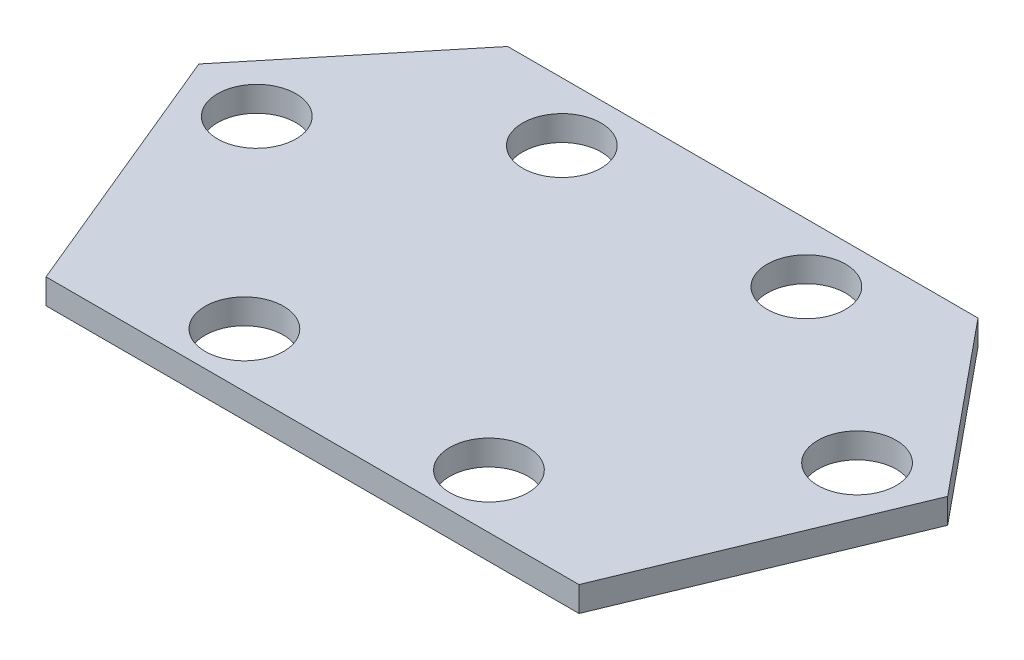
ISO-10303-21;
HEADER;
FILE_DESCRIPTION(('STEP AP214'),'2;1');
FILE_NAME('part.step','',(''),(''),'','','');
FILE_SCHEMA(('AUTOMOTIVE_DESIGN { 1 0 10303 214 1 1 1 1 }'));
ENDSEC;
DATA;
#1=APPLICATION_CONTEXT('core data for automotive mechanical design processes');
#2=APPLICATION_PROTOCOL_DEFINITION('international standard','automotive_design',2000,#1);
#3=PRODUCT_CONTEXT('',#1,'mechanical');
#4=PRODUCT('Part','Part','',(#3));
#5=PRODUCT_RELATED_PRODUCT_CATEGORY('part','',(#4));
#6=PRODUCT_DEFINITION_FORMATION('','',#4);
#7=PRODUCT_DEFINITION_CONTEXT('part definition',#1,'design');
#8=PRODUCT_DEFINITION('design','',#6,#7);
#9=PRODUCT_DEFINITION_SHAPE('','',#8);
#10=(LENGTH_UNIT() NAMED_UNIT(*) SI_UNIT(.MILLI.,.METRE.));
#11=(NAMED_UNIT(*) PLANE_ANGLE_UNIT() SI_UNIT($,.RADIAN.));
#12=(NAMED_UNIT(*) SI_UNIT($,.STERADIAN.) SOLID_ANGLE_UNIT());
#13=UNCERTAINTY_MEASURE_WITH_UNIT(LENGTH_MEASURE(1.E-05),#10,'distance_accuracy_value','');
#14=(GEOMETRIC_REPRESENTATION_CONTEXT(3) GLOBAL_UNCERTAINTY_ASSIGNED_CONTEXT((#13)) GLOBAL_UNIT_ASSIGNED_CONTEXT((#10,
#11,#12)) REPRESENTATION_CONTEXT('',''));
#15=CARTESIAN_POINT('',(0.,0.,0.));
#16=DIRECTION('',(0.,0.,1.));
#17=DIRECTION('',(1.,0.,0.));
#18=AXIS2_PLACEMENT_3D('',#15,#16,#17);
#19=CARTESIAN_POINT('',(0.,4.,0.));
#20=DIRECTION('',(0.,-1.,0.));
#21=DIRECTION('',(0.,0.,-1.));
#22=AXIS2_PLACEMENT_3D('',#19,#20,#21);
#23=PLANE('',#22);
#24=DIRECTION('',(-0.63458212057777,0.,-0.772855440715157));
#25=VECTOR('',#24,1.);
#26=CARTESIAN_POINT('',(75.,4.,-99.7096837484337));
#27=LINE('',#26,#25);
#28=CARTESIAN_POINT('',(119.420748440444,4.,-45.6098028983727));
#29=VERTEX_POINT('',#28);
#30=CARTESIAN_POINT('',(75.,4.,-99.7096837484337));
#31=VERTEX_POINT('',#30);
#32=EDGE_CURVE('E136',#29,#31,#27,.T.);
#33=ORIENTED_EDGE('',*,*,#32,.T.);
#34=DIRECTION('',(-1.,0.,0.));
#35=VECTOR('',#34,1.);
#36=CARTESIAN_POINT('',(-75.,4.,-99.7096837484337));
#37=LINE('',#36,#35);
#38=CARTESIAN_POINT('',(-75.,4.,-99.7096837484337));
#39=VERTEX_POINT('',#38);
#40=EDGE_CURVE('E94',#31,#39,#37,.T.);
#41=ORIENTED_EDGE('',*,*,#40,.T.);
#42=DIRECTION('',(-0.63458212057777,0.,0.772855440715157));
#43=VECTOR('',#42,1.);
#44=CARTESIAN_POINT('',(-75.,4.,-99.7096837484337));
#45=LINE('',#44,#43);
#46=CARTESIAN_POINT('',(-119.420748440444,4.,-45.6098028983727));
#47=VERTEX_POINT('',#46);
#48=EDGE_CURVE('E107',#39,#47,#45,.T.);
#49=ORIENTED_EDGE('',*,*,#48,.T.);
#50=DIRECTION('',(0.382452760449377,0.,0.923975046213182));
#51=VECTOR('',#50,1.);
#52=CARTESIAN_POINT('',(-119.420748440444,4.,-45.6098028983727));
#53=LINE('',#52,#51);
#54=CARTESIAN_POINT('',(-85.,4.,37.5479512608137));
#55=VERTEX_POINT('',#54);
#56=EDGE_CURVE('E101',#47,#55,#53,.T.);
#57=ORIENTED_EDGE('',*,*,#56,.T.);
#58=DIRECTION('',(1.,0.,0.));
#59=VECTOR('',#58,1.);
#60=CARTESIAN_POINT('',(85.,4.,37.5479512608137));
#61=LINE('',#60,#59);
#62=CARTESIAN_POINT('',(85.,4.,37.5479512608137));
#63=VERTEX_POINT('',#62);
#64=EDGE_CURVE('E105',#55,#63,#61,.T.);
#65=ORIENTED_EDGE('',*,*,#64,.T.);
#66=DIRECTION('',(0.382452760449377,0.,-0.923975046213182));
#67=VECTOR('',#66,1.);
#68=CARTESIAN_POINT('',(119.420748440444,4.,-45.6098028983727));
#69=LINE('',#68,#67);
#70=EDGE_CURVE('E57',#63,#29,#69,.T.);
#71=ORIENTED_EDGE('',*,*,#70,.T.);
#72=EDGE_LOOP('',(#33,#41,#49,#57,#65,#71));
#73=FACE_BOUND('',#72,.T.);
#74=CARTESIAN_POINT('',(-95.7300057121245,4.,-40.398538956961));
#75=DIRECTION('',(0.,1.,0.));
#76=DIRECTION('',(0.,0.,1.));
#77=AXIS2_PLACEMENT_3D('',#74,#75,#76);
#78=CIRCLE('',#77,12.5);
#79=CARTESIAN_POINT('',(-95.7300057121245,4.,-27.898538956961));
#80=VERTEX_POINT('',#79);
#81=EDGE_CURVE('E129',#80,#80,#78,.T.);
#82=ORIENTED_EDGE('',*,*,#81,.F.);
#83=EDGE_LOOP('',(#82));
#84=FACE_BOUND('',#83,.T.);
#85=CARTESIAN_POINT('',(-39.,4.,-80.9719510722377));
#86=DIRECTION('',(0.,1.,0.));
#87=DIRECTION('',(0.,0.,1.));
#88=AXIS2_PLACEMENT_3D('',#85,#86,#87);
#89=CIRCLE('',#88,12.5);
#90=CARTESIAN_POINT('',(-39.,4.,-68.4719510722377));
#91=VERTEX_POINT('',#90);
#92=EDGE_CURVE('E220',#91,#91,#89,.T.);
#93=ORIENTED_EDGE('',*,*,#92,.F.);
#94=EDGE_LOOP('',(#93));
#95=FACE_BOUND('',#94,.T.);
#96=CARTESIAN_POINT('',(-39.,4.,20.275462646618));
#97=DIRECTION('',(0.,1.,0.));
#98=DIRECTION('',(0.,0.,1.));
#99=AXIS2_PLACEMENT_3D('',#96,#97,#98);
#100=CIRCLE('',#99,12.5);
#101=CARTESIAN_POINT('',(-39.,4.,32.775462646618));
#102=VERTEX_POINT('',#101);
#103=EDGE_CURVE('E214',#102,#102,#100,.T.);
#104=ORIENTED_EDGE('',*,*,#103,.F.);
#105=EDGE_LOOP('',(#104));
#106=FACE_BOUND('',#105,.T.);
#107=CARTESIAN_POINT('',(39.,4.,20.275462646618));
#108=DIRECTION('',(0.,1.,0.));
#109=DIRECTION('',(0.,0.,-1.));
#110=AXIS2_PLACEMENT_3D('',#107,#108,#109);
#111=CIRCLE('',#110,12.5);
#112=CARTESIAN_POINT('',(39.,4.,7.775462646618));
#113=VERTEX_POINT('',#112);
#114=EDGE_CURVE('E208',#113,#113,#111,.T.);
#115=ORIENTED_EDGE('',*,*,#114,.F.);
#116=EDGE_LOOP('',(#115));
#117=FACE_BOUND('',#116,.T.);
#118=CARTESIAN_POINT('',(39.,4.,-80.9719510722377));
#119=DIRECTION('',(0.,1.,0.));
#120=DIRECTION('',(0.,0.,-1.));
#121=AXIS2_PLACEMENT_3D('',#118,#119,#120);
#122=CIRCLE('',#121,12.5);
#123=CARTESIAN_POINT('',(39.,4.,-93.4719510722377));
#124=VERTEX_POINT('',#123);
#125=EDGE_CURVE('E202',#124,#124,#122,.T.);
#126=ORIENTED_EDGE('',*,*,#125,.F.);
#127=EDGE_LOOP('',(#126));
#128=FACE_BOUND('',#127,.T.);
#129=CARTESIAN_POINT('',(95.7300057121245,4.,-40.398538956961));
#130=DIRECTION('',(0.,1.,0.));
#131=DIRECTION('',(0.,0.,-1.));
#132=AXIS2_PLACEMENT_3D('',#129,#130,#131);
#133=CIRCLE('',#132,12.5);
#134=CARTESIAN_POINT('',(95.7300057121245,4.,-52.898538956961));
#135=VERTEX_POINT('',#134);
#136=EDGE_CURVE('E193',#135,#135,#133,.T.);
#137=ORIENTED_EDGE('',*,*,#136,.F.);
#138=EDGE_LOOP('',(#137));
#139=FACE_BOUND('',#138,.T.);
#140=ADVANCED_FACE('F40',(#73,#84,#95,#106,#117,#128,#139),#23,.F.);
#141=CARTESIAN_POINT('',(0.,-4.,0.));
#142=DIRECTION('',(0.,-1.,0.));
#143=DIRECTION('',(0.,0.,-1.));
#144=AXIS2_PLACEMENT_3D('',#141,#142,#143);
#145=PLANE('',#144);
#146=CARTESIAN_POINT('',(39.,-4.,-80.9719510722377));
#147=DIRECTION('',(0.,1.,0.));
#148=DIRECTION('',(0.,0.,-1.));
#149=AXIS2_PLACEMENT_3D('',#146,#147,#148);
#150=CIRCLE('',#149,12.5);
#151=CARTESIAN_POINT('',(39.,-4.,-93.4719510722377));
#152=VERTEX_POINT('',#151);
#153=EDGE_CURVE('E199',#152,#152,#150,.T.);
#154=ORIENTED_EDGE('',*,*,#153,.T.);
#155=EDGE_LOOP('',(#154));
#156=FACE_BOUND('',#155,.T.);
#157=CARTESIAN_POINT('',(-39.,-4.,20.275462646618));
#158=DIRECTION('',(0.,1.,0.));
#159=DIRECTION('',(0.,0.,1.));
#160=AXIS2_PLACEMENT_3D('',#157,#158,#159);
#161=CIRCLE('',#160,12.5);
#162=CARTESIAN_POINT('',(-39.,-4.,32.775462646618));
#163=VERTEX_POINT('',#162);
#164=EDGE_CURVE('E211',#163,#163,#161,.T.);
#165=ORIENTED_EDGE('',*,*,#164,.T.);
#166=EDGE_LOOP('',(#165));
#167=FACE_BOUND('',#166,.T.);
#168=CARTESIAN_POINT('',(-95.7300057121245,-4.,-40.398538956961));
#169=DIRECTION('',(0.,1.,0.));
#170=DIRECTION('',(0.,0.,1.));
#171=AXIS2_PLACEMENT_3D('',#168,#169,#170);
#172=CIRCLE('',#171,12.5);
#173=CARTESIAN_POINT('',(-95.7300057121245,-4.,-27.898538956961));
#174=VERTEX_POINT('',#173);
#175=EDGE_CURVE('E223',#174,#174,#172,.T.);
#176=ORIENTED_EDGE('',*,*,#175,.T.);
#177=EDGE_LOOP('',(#176));
#178=FACE_BOUND('',#177,.T.);
#179=DIRECTION('',(-0.63458212057777,0.,-0.772855440715157));
#180=VECTOR('',#179,1.);
#181=CARTESIAN_POINT('',(75.,-4.,-99.7096837484337));
#182=LINE('',#181,#180);
#183=CARTESIAN_POINT('',(119.420748440444,-4.,-45.6098028983727));
#184=VERTEX_POINT('',#183);
#185=CARTESIAN_POINT('',(75.,-4.,-99.7096837484337));
#186=VERTEX_POINT('',#185);
#187=EDGE_CURVE('E125',#184,#186,#182,.T.);
#188=ORIENTED_EDGE('',*,*,#187,.F.);
#189=DIRECTION('',(0.382452760449377,0.,-0.923975046213182));
#190=VECTOR('',#189,1.);
#191=CARTESIAN_POINT('',(119.420748440444,-4.,-45.6098028983727));
#192=LINE('',#191,#190);
#193=CARTESIAN_POINT('',(85.,-4.,37.5479512608137));
#194=VERTEX_POINT('',#193);
#195=EDGE_CURVE('E86',#194,#184,#192,.T.);
#196=ORIENTED_EDGE('',*,*,#195,.F.);
#197=DIRECTION('',(1.,0.,0.));
#198=VECTOR('',#197,1.);
#199=CARTESIAN_POINT('',(85.,-4.,37.5479512608137));
#200=LINE('',#199,#198);
#201=CARTESIAN_POINT('',(-85.,-4.,37.5479512608137));
#202=VERTEX_POINT('',#201);
#203=EDGE_CURVE('E80',#202,#194,#200,.T.);
#204=ORIENTED_EDGE('',*,*,#203,.F.);
#205=DIRECTION('',(0.382452760449377,0.,0.923975046213182));
#206=VECTOR('',#205,1.);
#207=CARTESIAN_POINT('',(-119.420748440444,-4.,-45.6098028983727));
#208=LINE('',#207,#206);
#209=CARTESIAN_POINT('',(-119.420748440444,-4.,-45.6098028983727));
#210=VERTEX_POINT('',#209);
#211=EDGE_CURVE('E115',#210,#202,#208,.T.);
#212=ORIENTED_EDGE('',*,*,#211,.F.);
#213=DIRECTION('',(-0.63458212057777,0.,0.772855440715157));
#214=VECTOR('',#213,1.);
#215=CARTESIAN_POINT('',(-75.,-4.,-99.7096837484337));
#216=LINE('',#215,#214);
#217=CARTESIAN_POINT('',(-75.,-4.,-99.7096837484337));
#218=VERTEX_POINT('',#217);
#219=EDGE_CURVE('E131',#218,#210,#216,.T.);
#220=ORIENTED_EDGE('',*,*,#219,.F.);
#221=DIRECTION('',(-1.,0.,0.));
#222=VECTOR('',#221,1.);
#223=CARTESIAN_POINT('',(-75.,-4.,-99.7096837484337));
#224=LINE('',#223,#222);
#225=EDGE_CURVE('E128',#186,#218,#224,.T.);
#226=ORIENTED_EDGE('',*,*,#225,.F.);
#227=EDGE_LOOP('',(#188,#196,#204,#212,#220,#226));
#228=FACE_BOUND('',#227,.T.);
#229=CARTESIAN_POINT('',(-39.,-4.,-80.9719510722377));
#230=DIRECTION('',(0.,1.,0.));
#231=DIRECTION('',(0.,0.,1.));
#232=AXIS2_PLACEMENT_3D('',#229,#230,#231);
#233=CIRCLE('',#232,12.5);
#234=CARTESIAN_POINT('',(-39.,-4.,-68.4719510722377));
#235=VERTEX_POINT('',#234);
#236=EDGE_CURVE('E217',#235,#235,#233,.T.);
#237=ORIENTED_EDGE('',*,*,#236,.T.);
#238=EDGE_LOOP('',(#237));
#239=FACE_BOUND('',#238,.T.);
#240=CARTESIAN_POINT('',(39.,-4.,20.275462646618));
#241=DIRECTION('',(0.,1.,0.));
#242=DIRECTION('',(0.,0.,-1.));
#243=AXIS2_PLACEMENT_3D('',#240,#241,#242);
#244=CIRCLE('',#243,12.5);
#245=CARTESIAN_POINT('',(39.,-4.,7.775462646618));
#246=VERTEX_POINT('',#245);
#247=EDGE_CURVE('E205',#246,#246,#244,.T.);
#248=ORIENTED_EDGE('',*,*,#247,.T.);
#249=EDGE_LOOP('',(#248));
#250=FACE_BOUND('',#249,.T.);
#251=CARTESIAN_POINT('',(95.7300057121245,-4.,-40.398538956961));
#252=DIRECTION('',(0.,1.,0.));
#253=DIRECTION('',(0.,0.,-1.));
#254=AXIS2_PLACEMENT_3D('',#251,#252,#253);
#255=CIRCLE('',#254,12.5);
#256=CARTESIAN_POINT('',(95.7300057121245,-4.,-52.898538956961));
#257=VERTEX_POINT('',#256);
#258=EDGE_CURVE('E196',#257,#257,#255,.T.);
#259=ORIENTED_EDGE('',*,*,#258,.T.);
#260=EDGE_LOOP('',(#259));
#261=FACE_BOUND('',#260,.T.);
#262=ADVANCED_FACE('F145',(#156,#167,#178,#228,#239,#250,#261),#145,.T.);
#263=CARTESIAN_POINT('',(75.,4.,-99.7096837484337));
#264=DIRECTION('',(-0.772855440715157,0.,0.63458212057777));
#265=DIRECTION('',(0.63458212057777,0.,0.772855440715157));
#266=AXIS2_PLACEMENT_3D('',#263,#264,#265);
#267=PLANE('',#266);
#268=ORIENTED_EDGE('',*,*,#187,.T.);
#269=DIRECTION('',(0.,-1.,0.));
#270=VECTOR('',#269,1.);
#271=CARTESIAN_POINT('',(75.,4.,-99.7096837484337));
#272=LINE('',#271,#270);
#273=EDGE_CURVE('E11',#31,#186,#272,.T.);
#274=ORIENTED_EDGE('',*,*,#273,.F.);
#275=ORIENTED_EDGE('',*,*,#32,.F.);
#276=DIRECTION('',(0.,-1.,0.));
#277=VECTOR('',#276,1.);
#278=CARTESIAN_POINT('',(119.420748440444,4.,-45.6098028983727));
#279=LINE('',#278,#277);
#280=EDGE_CURVE('E121',#29,#184,#279,.T.);
#281=ORIENTED_EDGE('',*,*,#280,.T.);
#282=EDGE_LOOP('',(#268,#274,#275,#281));
#283=FACE_BOUND('',#282,.T.);
#284=ADVANCED_FACE('F42',(#283),#267,.F.);
#285=CARTESIAN_POINT('',(-75.,4.,-99.7096837484337));
#286=DIRECTION('',(0.,0.,1.));
#287=DIRECTION('',(1.,0.,0.));
#288=AXIS2_PLACEMENT_3D('',#285,#286,#287);
#289=PLANE('',#288);
#290=ORIENTED_EDGE('',*,*,#225,.T.);
#291=DIRECTION('',(0.,-1.,0.));
#292=VECTOR('',#291,1.);
#293=CARTESIAN_POINT('',(-75.,4.,-99.7096837484337));
#294=LINE('',#293,#292);
#295=EDGE_CURVE('E49',#39,#218,#294,.T.);
#296=ORIENTED_EDGE('',*,*,#295,.F.);
#297=ORIENTED_EDGE('',*,*,#40,.F.);
#298=ORIENTED_EDGE('',*,*,#273,.T.);
#299=EDGE_LOOP('',(#290,#296,#297,#298));
#300=FACE_BOUND('',#299,.T.);
#301=ADVANCED_FACE('F305',(#300),#289,.F.);
#302=CARTESIAN_POINT('',(-75.,4.,-99.7096837484337));
#303=DIRECTION('',(0.772855440715157,0.,0.63458212057777));
#304=DIRECTION('',(0.63458212057777,0.,-0.772855440715157));
#305=AXIS2_PLACEMENT_3D('',#302,#303,#304);
#306=PLANE('',#305);
#307=ORIENTED_EDGE('',*,*,#219,.T.);
#308=DIRECTION('',(0.,-1.,0.));
#309=VECTOR('',#308,1.);
#310=CARTESIAN_POINT('',(-119.420748440444,4.,-45.6098028983727));
#311=LINE('',#310,#309);
#312=EDGE_CURVE('E116',#47,#210,#311,.T.);
#313=ORIENTED_EDGE('',*,*,#312,.F.);
#314=ORIENTED_EDGE('',*,*,#48,.F.);
#315=ORIENTED_EDGE('',*,*,#295,.T.);
#316=EDGE_LOOP('',(#307,#313,#314,#315));
#317=FACE_BOUND('',#316,.T.);
#318=ADVANCED_FACE('F142',(#317),#306,.F.);
#319=CARTESIAN_POINT('',(-119.420748440444,4.,-45.6098028983727));
#320=DIRECTION('',(0.923975046213182,0.,-0.382452760449377));
#321=DIRECTION('',(-0.382452760449377,0.,-0.923975046213182));
#322=AXIS2_PLACEMENT_3D('',#319,#320,#321);
#323=PLANE('',#322);
#324=ORIENTED_EDGE('',*,*,#211,.T.);
#325=DIRECTION('',(0.,-1.,0.));
#326=VECTOR('',#325,1.);
#327=CARTESIAN_POINT('',(-85.,4.,37.5479512608137));
#328=LINE('',#327,#326);
#329=EDGE_CURVE('E112',#55,#202,#328,.T.);
#330=ORIENTED_EDGE('',*,*,#329,.F.);
#331=ORIENTED_EDGE('',*,*,#56,.F.);
#332=ORIENTED_EDGE('',*,*,#312,.T.);
#333=EDGE_LOOP('',(#324,#330,#331,#332));
#334=FACE_BOUND('',#333,.T.);
#335=ADVANCED_FACE('F113',(#334),#323,.F.);
#336=CARTESIAN_POINT('',(85.,4.,37.5479512608137));
#337=DIRECTION('',(0.,0.,-1.));
#338=DIRECTION('',(-1.,0.,0.));
#339=AXIS2_PLACEMENT_3D('',#336,#337,#338);
#340=PLANE('',#339);
#341=ORIENTED_EDGE('',*,*,#203,.T.);
#342=DIRECTION('',(0.,-1.,0.));
#343=VECTOR('',#342,1.);
#344=CARTESIAN_POINT('',(85.,4.,37.5479512608137));
#345=LINE('',#344,#343);
#346=EDGE_CURVE('E117',#63,#194,#345,.T.);
#347=ORIENTED_EDGE('',*,*,#346,.F.);
#348=ORIENTED_EDGE('',*,*,#64,.F.);
#349=ORIENTED_EDGE('',*,*,#329,.T.);
#350=EDGE_LOOP('',(#341,#347,#348,#349));
#351=FACE_BOUND('',#350,.T.);
#352=ADVANCED_FACE('F119',(#351),#340,.F.);
#353=CARTESIAN_POINT('',(119.420748440444,4.,-45.6098028983727));
#354=DIRECTION('',(-0.923975046213182,0.,-0.382452760449377));
#355=DIRECTION('',(-0.382452760449377,0.,0.923975046213182));
#356=AXIS2_PLACEMENT_3D('',#353,#354,#355);
#357=PLANE('',#356);
#358=ORIENTED_EDGE('',*,*,#195,.T.);
#359=ORIENTED_EDGE('',*,*,#280,.F.);
#360=ORIENTED_EDGE('',*,*,#70,.F.);
#361=ORIENTED_EDGE('',*,*,#346,.T.);
#362=EDGE_LOOP('',(#358,#359,#360,#361));
#363=FACE_BOUND('',#362,.T.);
#364=ADVANCED_FACE('F150',(#363),#357,.F.);
#365=CARTESIAN_POINT('',(-95.7300057121245,4.,-40.398538956961));
#366=DIRECTION('',(0.,-1.,0.));
#367=DIRECTION('',(0.,0.,-1.));
#368=AXIS2_PLACEMENT_3D('',#365,#366,#367);
#369=CYLINDRICAL_SURFACE('',#368,12.5);
#370=ORIENTED_EDGE('',*,*,#81,.T.);
#371=EDGE_LOOP('',(#370));
#372=FACE_BOUND('',#371,.T.);
#373=ORIENTED_EDGE('',*,*,#175,.F.);
#374=EDGE_LOOP('',(#373));
#375=FACE_BOUND('',#374,.T.);
#376=ADVANCED_FACE('F152',(#372,#375),#369,.F.);
#377=CARTESIAN_POINT('',(-39.,4.,-80.9719510722377));
#378=DIRECTION('',(0.,-1.,0.));
#379=DIRECTION('',(0.,0.,-1.));
#380=AXIS2_PLACEMENT_3D('',#377,#378,#379);
#381=CYLINDRICAL_SURFACE('',#380,12.5);
#382=ORIENTED_EDGE('',*,*,#92,.T.);
#383=EDGE_LOOP('',(#382));
#384=FACE_BOUND('',#383,.T.);
#385=ORIENTED_EDGE('',*,*,#236,.F.);
#386=EDGE_LOOP('',(#385));
#387=FACE_BOUND('',#386,.T.);
#388=ADVANCED_FACE('F158',(#384,#387),#381,.F.);
#389=CARTESIAN_POINT('',(-39.,4.,20.275462646618));
#390=DIRECTION('',(0.,-1.,0.));
#391=DIRECTION('',(0.,0.,-1.));
#392=AXIS2_PLACEMENT_3D('',#389,#390,#391);
#393=CYLINDRICAL_SURFACE('',#392,12.5);
#394=ORIENTED_EDGE('',*,*,#103,.T.);
#395=EDGE_LOOP('',(#394));
#396=FACE_BOUND('',#395,.T.);
#397=ORIENTED_EDGE('',*,*,#164,.F.);
#398=EDGE_LOOP('',(#397));
#399=FACE_BOUND('',#398,.T.);
#400=ADVANCED_FACE('F172',(#396,#399),#393,.F.);
#401=CARTESIAN_POINT('',(39.,4.,20.275462646618));
#402=DIRECTION('',(0.,-1.,0.));
#403=DIRECTION('',(0.,0.,-1.));
#404=AXIS2_PLACEMENT_3D('',#401,#402,#403);
#405=CYLINDRICAL_SURFACE('',#404,12.5);
#406=ORIENTED_EDGE('',*,*,#114,.T.);
#407=EDGE_LOOP('',(#406));
#408=FACE_BOUND('',#407,.T.);
#409=ORIENTED_EDGE('',*,*,#247,.F.);
#410=EDGE_LOOP('',(#409));
#411=FACE_BOUND('',#410,.T.);
#412=ADVANCED_FACE('F176',(#408,#411),#405,.F.);
#413=CARTESIAN_POINT('',(39.,4.,-80.9719510722377));
#414=DIRECTION('',(0.,-1.,0.));
#415=DIRECTION('',(0.,0.,-1.));
#416=AXIS2_PLACEMENT_3D('',#413,#414,#415);
#417=CYLINDRICAL_SURFACE('',#416,12.5);
#418=ORIENTED_EDGE('',*,*,#125,.T.);
#419=EDGE_LOOP('',(#418));
#420=FACE_BOUND('',#419,.T.);
#421=ORIENTED_EDGE('',*,*,#153,.F.);
#422=EDGE_LOOP('',(#421));
#423=FACE_BOUND('',#422,.T.);
#424=ADVANCED_FACE('F180',(#420,#423),#417,.F.);
#425=CARTESIAN_POINT('',(95.7300057121245,4.,-40.398538956961));
#426=DIRECTION('',(0.,-1.,0.));
#427=DIRECTION('',(0.,0.,-1.));
#428=AXIS2_PLACEMENT_3D('',#425,#426,#427);
#429=CYLINDRICAL_SURFACE('',#428,12.5);
#430=ORIENTED_EDGE('',*,*,#136,.T.);
#431=EDGE_LOOP('',(#430));
#432=FACE_BOUND('',#431,.T.);
#433=ORIENTED_EDGE('',*,*,#258,.F.);
#434=EDGE_LOOP('',(#433));
#435=FACE_BOUND('',#434,.T.);
#436=ADVANCED_FACE('F184',(#432,#435),#429,.F.);
#437=CLOSED_SHELL('',(#140,#262,#284,#301,#318,#335,#352,#364,#376,#388,#400,#412,#424,#436));
#438=MANIFOLD_SOLID_BREP('B2',#437);
#439=ADVANCED_BREP_SHAPE_REPRESENTATION('',(#18,#438),#14);
#440=SHAPE_DEFINITION_REPRESENTATION(#9,#439);
ENDSEC;
END-ISO-10303-21;
